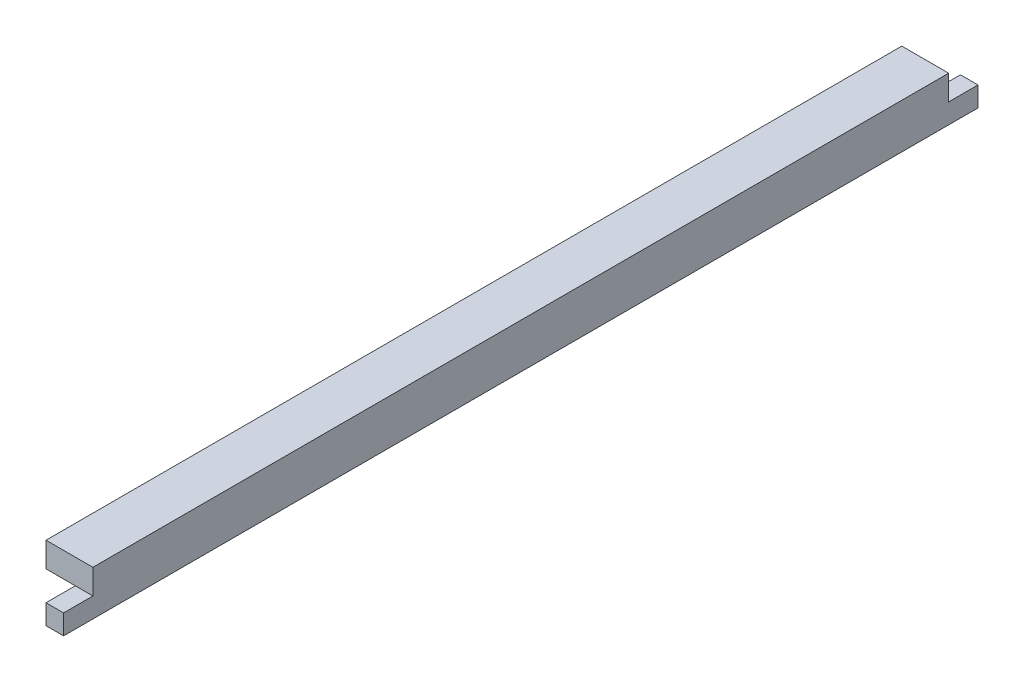
ISO-10303-21;
HEADER;
FILE_DESCRIPTION(('STEP AP214'),'2;1');
FILE_NAME('part.step','',(''),(''),'','','');
FILE_SCHEMA(('AUTOMOTIVE_DESIGN { 1 0 10303 214 1 1 1 1 }'));
ENDSEC;
DATA;
#1=APPLICATION_CONTEXT('core data for automotive mechanical design processes');
#2=APPLICATION_PROTOCOL_DEFINITION('international standard','automotive_design',2000,#1);
#3=PRODUCT_CONTEXT('',#1,'mechanical');
#4=PRODUCT('Part','Part','',(#3));
#5=PRODUCT_RELATED_PRODUCT_CATEGORY('part','',(#4));
#6=PRODUCT_DEFINITION_FORMATION('','',#4);
#7=PRODUCT_DEFINITION_CONTEXT('part definition',#1,'design');
#8=PRODUCT_DEFINITION('design','',#6,#7);
#9=PRODUCT_DEFINITION_SHAPE('','',#8);
#10=(LENGTH_UNIT() NAMED_UNIT(*) SI_UNIT(.MILLI.,.METRE.));
#11=(NAMED_UNIT(*) PLANE_ANGLE_UNIT() SI_UNIT($,.RADIAN.));
#12=(NAMED_UNIT(*) SI_UNIT($,.STERADIAN.) SOLID_ANGLE_UNIT());
#13=UNCERTAINTY_MEASURE_WITH_UNIT(LENGTH_MEASURE(1.E-05),#10,'distance_accuracy_value','');
#14=(GEOMETRIC_REPRESENTATION_CONTEXT(3) GLOBAL_UNCERTAINTY_ASSIGNED_CONTEXT((#13)) GLOBAL_UNIT_ASSIGNED_CONTEXT((#10,
#11,#12)) REPRESENTATION_CONTEXT('',''));
#15=CARTESIAN_POINT('',(0.,0.,0.));
#16=DIRECTION('',(0.,0.,1.));
#17=DIRECTION('',(1.,0.,0.));
#18=AXIS2_PLACEMENT_3D('',#15,#16,#17);
#19=CARTESIAN_POINT('',(2.63390369239648E-13,10.795,0.));
#20=DIRECTION('',(0.,1.,0.));
#21=DIRECTION('',(0.,0.,-1.));
#22=AXIS2_PLACEMENT_3D('',#19,#20,#21);
#23=PLANE('',#22);
#24=DIRECTION('',(0.,0.,-1.));
#25=VECTOR('',#24,1.);
#26=CARTESIAN_POINT('',(400.84375,10.7950000000028,-247.65));
#27=LINE('',#26,#25);
#28=CARTESIAN_POINT('',(400.84375,10.7950000000028,231.775));
#29=VERTEX_POINT('',#28);
#30=CARTESIAN_POINT('',(400.84375,10.7950000000028,-231.775));
#31=VERTEX_POINT('',#30);
#32=EDGE_CURVE('E11',#29,#31,#27,.T.);
#33=ORIENTED_EDGE('',*,*,#32,.F.);
#34=DIRECTION('',(-1.,0.,0.));
#35=VECTOR('',#34,1.);
#36=CARTESIAN_POINT('',(410.36875,10.7950000000029,231.775));
#37=LINE('',#36,#35);
#38=CARTESIAN_POINT('',(384.96875,10.7950000000027,231.775));
#39=VERTEX_POINT('',#38);
#40=EDGE_CURVE('E174',#29,#39,#37,.T.);
#41=ORIENTED_EDGE('',*,*,#40,.T.);
#42=DIRECTION('',(0.,0.,-1.));
#43=VECTOR('',#42,1.);
#44=CARTESIAN_POINT('',(384.96875,10.7950000000027,231.775));
#45=LINE('',#44,#43);
#46=CARTESIAN_POINT('',(384.96875,10.7950000000027,-231.775));
#47=VERTEX_POINT('',#46);
#48=EDGE_CURVE('E74',#39,#47,#45,.T.);
#49=ORIENTED_EDGE('',*,*,#48,.T.);
#50=DIRECTION('',(1.,0.,0.));
#51=VECTOR('',#50,1.);
#52=CARTESIAN_POINT('',(410.36875,10.7950000000029,-231.775));
#53=LINE('',#52,#51);
#54=EDGE_CURVE('E41',#47,#31,#53,.T.);
#55=ORIENTED_EDGE('',*,*,#54,.T.);
#56=EDGE_LOOP('',(#33,#41,#49,#55));
#57=FACE_BOUND('',#56,.T.);
#58=ADVANCED_FACE('F32',(#57),#23,.F.);
#59=CARTESIAN_POINT('',(410.368750000004,-453.450368851427,231.775));
#60=DIRECTION('',(1.,0.,0.));
#61=DIRECTION('',(0.,0.,1.));
#62=AXIS2_PLACEMENT_3D('',#59,#60,#61);
#63=PLANE('',#62);
#64=DIRECTION('',(0.,1.,0.));
#65=VECTOR('',#64,1.);
#66=CARTESIAN_POINT('',(410.368750000004,-453.450368851427,231.775));
#67=LINE('',#66,#65);
#68=CARTESIAN_POINT('',(410.36875,10.7950000000029,231.775));
#69=VERTEX_POINT('',#68);
#70=CARTESIAN_POINT('',(410.36875,24.2570000000029,231.775));
#71=VERTEX_POINT('',#70);
#72=EDGE_CURVE('E78',#69,#71,#67,.T.);
#73=ORIENTED_EDGE('',*,*,#72,.F.);
#74=DIRECTION('',(0.,0.,1.));
#75=VECTOR('',#74,1.);
#76=CARTESIAN_POINT('',(410.36875,10.7950000000029,-247.65));
#77=LINE('',#76,#75);
#78=CARTESIAN_POINT('',(410.36875,10.7950000000029,247.65));
#79=VERTEX_POINT('',#78);
#80=EDGE_CURVE('E146',#69,#79,#77,.T.);
#81=ORIENTED_EDGE('',*,*,#80,.T.);
#82=DIRECTION('',(0.,1.,0.));
#83=VECTOR('',#82,1.);
#84=CARTESIAN_POINT('',(410.36875,3.17500000000287,247.65));
#85=LINE('',#84,#83);
#86=CARTESIAN_POINT('',(410.36875,2.86576318231369E-12,247.65));
#87=VERTEX_POINT('',#86);
#88=EDGE_CURVE('E132',#87,#79,#85,.T.);
#89=ORIENTED_EDGE('',*,*,#88,.F.);
#90=DIRECTION('',(0.,0.,1.));
#91=VECTOR('',#90,1.);
#92=CARTESIAN_POINT('',(410.36875,2.86576318231369E-12,-247.65));
#93=LINE('',#92,#91);
#94=CARTESIAN_POINT('',(410.36875,2.86576318231369E-12,-247.65));
#95=VERTEX_POINT('',#94);
#96=EDGE_CURVE('E130',#95,#87,#93,.T.);
#97=ORIENTED_EDGE('',*,*,#96,.F.);
#98=DIRECTION('',(0.,1.,0.));
#99=VECTOR('',#98,1.);
#100=CARTESIAN_POINT('',(410.36875,3.17500000000287,-247.65));
#101=LINE('',#100,#99);
#102=CARTESIAN_POINT('',(410.36875,10.7950000000029,-247.65));
#103=VERTEX_POINT('',#102);
#104=EDGE_CURVE('E116',#95,#103,#101,.T.);
#105=ORIENTED_EDGE('',*,*,#104,.T.);
#106=CARTESIAN_POINT('',(410.36875,10.7950000000029,-231.775));
#107=VERTEX_POINT('',#106);
#108=EDGE_CURVE('E154',#103,#107,#77,.T.);
#109=ORIENTED_EDGE('',*,*,#108,.T.);
#110=DIRECTION('',(0.,1.,0.));
#111=VECTOR('',#110,1.);
#112=CARTESIAN_POINT('',(410.368750000004,-453.450368851427,-231.775));
#113=LINE('',#112,#111);
#114=CARTESIAN_POINT('',(410.36875,24.2570000000029,-231.775));
#115=VERTEX_POINT('',#114);
#116=EDGE_CURVE('E58',#107,#115,#113,.T.);
#117=ORIENTED_EDGE('',*,*,#116,.T.);
#118=DIRECTION('',(0.,0.,-1.));
#119=VECTOR('',#118,1.);
#120=CARTESIAN_POINT('',(410.36875,24.2570000000029,231.775));
#121=LINE('',#120,#119);
#122=EDGE_CURVE('E157',#71,#115,#121,.T.);
#123=ORIENTED_EDGE('',*,*,#122,.F.);
#124=EDGE_LOOP('',(#73,#81,#89,#97,#105,#109,#117,#123));
#125=FACE_BOUND('',#124,.T.);
#126=ADVANCED_FACE('F34',(#125),#63,.T.);
#127=CARTESIAN_POINT('',(410.368750000004,-453.450368851427,231.775));
#128=DIRECTION('',(0.,0.,1.));
#129=DIRECTION('',(-1.,0.,0.));
#130=AXIS2_PLACEMENT_3D('',#127,#128,#129);
#131=PLANE('',#130);
#132=EDGE_CURVE('E69',#69,#29,#37,.T.);
#133=ORIENTED_EDGE('',*,*,#132,.F.);
#134=ORIENTED_EDGE('',*,*,#72,.T.);
#135=DIRECTION('',(1.,0.,0.));
#136=VECTOR('',#135,1.);
#137=CARTESIAN_POINT('',(410.36875,24.2570000000029,231.775));
#138=LINE('',#137,#136);
#139=CARTESIAN_POINT('',(384.96875,24.2570000000027,231.775));
#140=VERTEX_POINT('',#139);
#141=EDGE_CURVE('E193',#140,#71,#138,.T.);
#142=ORIENTED_EDGE('',*,*,#141,.F.);
#143=DIRECTION('',(0.,1.,0.));
#144=VECTOR('',#143,1.);
#145=CARTESIAN_POINT('',(384.968750000004,-453.450368851427,231.775));
#146=LINE('',#145,#144);
#147=EDGE_CURVE('E196',#39,#140,#146,.T.);
#148=ORIENTED_EDGE('',*,*,#147,.F.);
#149=ORIENTED_EDGE('',*,*,#40,.F.);
#150=EDGE_LOOP('',(#133,#134,#142,#148,#149));
#151=FACE_BOUND('',#150,.T.);
#152=ADVANCED_FACE('F205',(#151),#131,.T.);
#153=CARTESIAN_POINT('',(384.968750000004,-453.450368851427,231.775));
#154=DIRECTION('',(-1.,0.,0.));
#155=DIRECTION('',(0.,0.,-1.));
#156=AXIS2_PLACEMENT_3D('',#153,#154,#155);
#157=PLANE('',#156);
#158=ORIENTED_EDGE('',*,*,#48,.F.);
#159=ORIENTED_EDGE('',*,*,#147,.T.);
#160=DIRECTION('',(0.,0.,1.));
#161=VECTOR('',#160,1.);
#162=CARTESIAN_POINT('',(384.96875,24.2570000000027,231.775));
#163=LINE('',#162,#161);
#164=CARTESIAN_POINT('',(384.96875,24.2570000000027,-231.775));
#165=VERTEX_POINT('',#164);
#166=EDGE_CURVE('E190',#165,#140,#163,.T.);
#167=ORIENTED_EDGE('',*,*,#166,.F.);
#168=DIRECTION('',(0.,1.,0.));
#169=VECTOR('',#168,1.);
#170=CARTESIAN_POINT('',(384.968750000004,-453.450368851427,-231.775));
#171=LINE('',#170,#169);
#172=EDGE_CURVE('E197',#47,#165,#171,.T.);
#173=ORIENTED_EDGE('',*,*,#172,.F.);
#174=EDGE_LOOP('',(#158,#159,#167,#173));
#175=FACE_BOUND('',#174,.T.);
#176=ADVANCED_FACE('F207',(#175),#157,.T.);
#177=CARTESIAN_POINT('',(410.368750000004,-453.450368851427,-231.775));
#178=DIRECTION('',(0.,0.,-1.));
#179=DIRECTION('',(1.,0.,0.));
#180=AXIS2_PLACEMENT_3D('',#177,#178,#179);
#181=PLANE('',#180);
#182=ORIENTED_EDGE('',*,*,#54,.F.);
#183=ORIENTED_EDGE('',*,*,#172,.T.);
#184=DIRECTION('',(-1.,0.,0.));
#185=VECTOR('',#184,1.);
#186=CARTESIAN_POINT('',(410.36875,24.2570000000029,-231.775));
#187=LINE('',#186,#185);
#188=EDGE_CURVE('E187',#115,#165,#187,.T.);
#189=ORIENTED_EDGE('',*,*,#188,.F.);
#190=ORIENTED_EDGE('',*,*,#116,.F.);
#191=EDGE_CURVE('E173',#31,#107,#53,.T.);
#192=ORIENTED_EDGE('',*,*,#191,.F.);
#193=EDGE_LOOP('',(#182,#183,#189,#190,#192));
#194=FACE_BOUND('',#193,.T.);
#195=ADVANCED_FACE('F201',(#194),#181,.T.);
#196=CARTESIAN_POINT('',(1.69385725672636E-13,24.257,0.));
#197=DIRECTION('',(0.,1.,0.));
#198=DIRECTION('',(0.,0.,-1.));
#199=AXIS2_PLACEMENT_3D('',#196,#197,#198);
#200=PLANE('',#199);
#201=ORIENTED_EDGE('',*,*,#122,.T.);
#202=ORIENTED_EDGE('',*,*,#188,.T.);
#203=ORIENTED_EDGE('',*,*,#166,.T.);
#204=ORIENTED_EDGE('',*,*,#141,.T.);
#205=EDGE_LOOP('',(#201,#202,#203,#204));
#206=FACE_BOUND('',#205,.T.);
#207=ADVANCED_FACE('F203',(#206),#200,.T.);
#208=CARTESIAN_POINT('',(2.63390369239648E-13,10.795,0.));
#209=DIRECTION('',(0.,-1.,0.));
#210=DIRECTION('',(0.,0.,1.));
#211=AXIS2_PLACEMENT_3D('',#208,#209,#210);
#212=PLANE('',#211);
#213=ORIENTED_EDGE('',*,*,#80,.F.);
#214=ORIENTED_EDGE('',*,*,#132,.T.);
#215=CARTESIAN_POINT('',(400.84375,10.7950000000028,247.65));
#216=VERTEX_POINT('',#215);
#217=EDGE_CURVE('E43',#216,#29,#27,.T.);
#218=ORIENTED_EDGE('',*,*,#217,.F.);
#219=DIRECTION('',(-1.,0.,0.));
#220=VECTOR('',#219,1.);
#221=CARTESIAN_POINT('',(410.36875,10.7950000000029,247.65));
#222=LINE('',#221,#220);
#223=EDGE_CURVE('E149',#79,#216,#222,.T.);
#224=ORIENTED_EDGE('',*,*,#223,.F.);
#225=EDGE_LOOP('',(#213,#214,#218,#224));
#226=FACE_BOUND('',#225,.T.);
#227=ADVANCED_FACE('F172',(#226),#212,.F.);
#228=CARTESIAN_POINT('',(400.84375,10.7950000000028,-247.65));
#229=VERTEX_POINT('',#228);
#230=EDGE_CURVE('E44',#31,#229,#27,.T.);
#231=ORIENTED_EDGE('',*,*,#230,.F.);
#232=ORIENTED_EDGE('',*,*,#191,.T.);
#233=ORIENTED_EDGE('',*,*,#108,.F.);
#234=DIRECTION('',(1.,0.,0.));
#235=VECTOR('',#234,1.);
#236=CARTESIAN_POINT('',(410.36875,10.7950000000029,-247.65));
#237=LINE('',#236,#235);
#238=EDGE_CURVE('E123',#229,#103,#237,.T.);
#239=ORIENTED_EDGE('',*,*,#238,.F.);
#240=EDGE_LOOP('',(#231,#232,#233,#239));
#241=FACE_BOUND('',#240,.T.);
#242=ADVANCED_FACE('F238',(#241),#212,.F.);
#243=CARTESIAN_POINT('',(410.36875,3.17500000000287,247.65));
#244=DIRECTION('',(0.,0.,-1.));
#245=DIRECTION('',(1.,0.,0.));
#246=AXIS2_PLACEMENT_3D('',#243,#244,#245);
#247=PLANE('',#246);
#248=ORIENTED_EDGE('',*,*,#223,.T.);
#249=DIRECTION('',(0.,1.,0.));
#250=VECTOR('',#249,1.);
#251=CARTESIAN_POINT('',(400.84375,3.1750000000028,247.65));
#252=LINE('',#251,#250);
#253=CARTESIAN_POINT('',(400.84375,2.79984369022657E-12,247.65));
#254=VERTEX_POINT('',#253);
#255=EDGE_CURVE('E158',#254,#216,#252,.T.);
#256=ORIENTED_EDGE('',*,*,#255,.F.);
#257=DIRECTION('',(-1.,0.,0.));
#258=VECTOR('',#257,1.);
#259=CARTESIAN_POINT('',(410.36875,2.86576318231369E-12,247.65));
#260=LINE('',#259,#258);
#261=EDGE_CURVE('E136',#87,#254,#260,.T.);
#262=ORIENTED_EDGE('',*,*,#261,.F.);
#263=ORIENTED_EDGE('',*,*,#88,.T.);
#264=EDGE_LOOP('',(#248,#256,#262,#263));
#265=FACE_BOUND('',#264,.T.);
#266=ADVANCED_FACE('F168',(#265),#247,.F.);
#267=CARTESIAN_POINT('',(400.84375,3.1750000000028,-247.65));
#268=DIRECTION('',(1.,0.,0.));
#269=DIRECTION('',(0.,0.,1.));
#270=AXIS2_PLACEMENT_3D('',#267,#268,#269);
#271=PLANE('',#270);
#272=ORIENTED_EDGE('',*,*,#217,.T.);
#273=ORIENTED_EDGE('',*,*,#32,.T.);
#274=ORIENTED_EDGE('',*,*,#230,.T.);
#275=DIRECTION('',(0.,1.,0.));
#276=VECTOR('',#275,1.);
#277=CARTESIAN_POINT('',(400.84375,3.1750000000028,-247.65));
#278=LINE('',#277,#276);
#279=CARTESIAN_POINT('',(400.84375,2.79984369022657E-12,-247.65));
#280=VERTEX_POINT('',#279);
#281=EDGE_CURVE('E127',#280,#229,#278,.T.);
#282=ORIENTED_EDGE('',*,*,#281,.F.);
#283=DIRECTION('',(0.,0.,-1.));
#284=VECTOR('',#283,1.);
#285=CARTESIAN_POINT('',(400.84375,2.79984369022657E-12,247.65));
#286=LINE('',#285,#284);
#287=EDGE_CURVE('E141',#254,#280,#286,.T.);
#288=ORIENTED_EDGE('',*,*,#287,.F.);
#289=ORIENTED_EDGE('',*,*,#255,.T.);
#290=EDGE_LOOP('',(#272,#273,#274,#282,#288,#289));
#291=FACE_BOUND('',#290,.T.);
#292=ADVANCED_FACE('F171',(#291),#271,.F.);
#293=CARTESIAN_POINT('',(410.36875,3.17500000000287,-247.65));
#294=DIRECTION('',(0.,0.,1.));
#295=DIRECTION('',(-1.,0.,0.));
#296=AXIS2_PLACEMENT_3D('',#293,#294,#295);
#297=PLANE('',#296);
#298=ORIENTED_EDGE('',*,*,#238,.T.);
#299=ORIENTED_EDGE('',*,*,#104,.F.);
#300=DIRECTION('',(1.,0.,0.));
#301=VECTOR('',#300,1.);
#302=CARTESIAN_POINT('',(400.84375,2.79984369022657E-12,-247.65));
#303=LINE('',#302,#301);
#304=EDGE_CURVE('E121',#280,#95,#303,.T.);
#305=ORIENTED_EDGE('',*,*,#304,.F.);
#306=ORIENTED_EDGE('',*,*,#281,.T.);
#307=EDGE_LOOP('',(#298,#299,#305,#306));
#308=FACE_BOUND('',#307,.T.);
#309=ADVANCED_FACE('F118',(#308),#297,.F.);
#310=CARTESIAN_POINT('',(3.38771451345272E-13,0.,0.));
#311=DIRECTION('',(0.,-1.,0.));
#312=DIRECTION('',(0.,0.,1.));
#313=AXIS2_PLACEMENT_3D('',#310,#311,#312);
#314=PLANE('',#313);
#315=ORIENTED_EDGE('',*,*,#304,.T.);
#316=ORIENTED_EDGE('',*,*,#96,.T.);
#317=ORIENTED_EDGE('',*,*,#261,.T.);
#318=ORIENTED_EDGE('',*,*,#287,.T.);
#319=EDGE_LOOP('',(#315,#316,#317,#318));
#320=FACE_BOUND('',#319,.T.);
#321=ADVANCED_FACE('F139',(#320),#314,.T.);
#322=CLOSED_SHELL('',(#58,#126,#152,#176,#195,#207,#227,#242,#266,#292,#309,#321));
#323=MANIFOLD_SOLID_BREP('B2',#322);
#324=ADVANCED_BREP_SHAPE_REPRESENTATION('',(#18,#323),#14);
#325=SHAPE_DEFINITION_REPRESENTATION(#9,#324);
ENDSEC;
END-ISO-10303-21;
